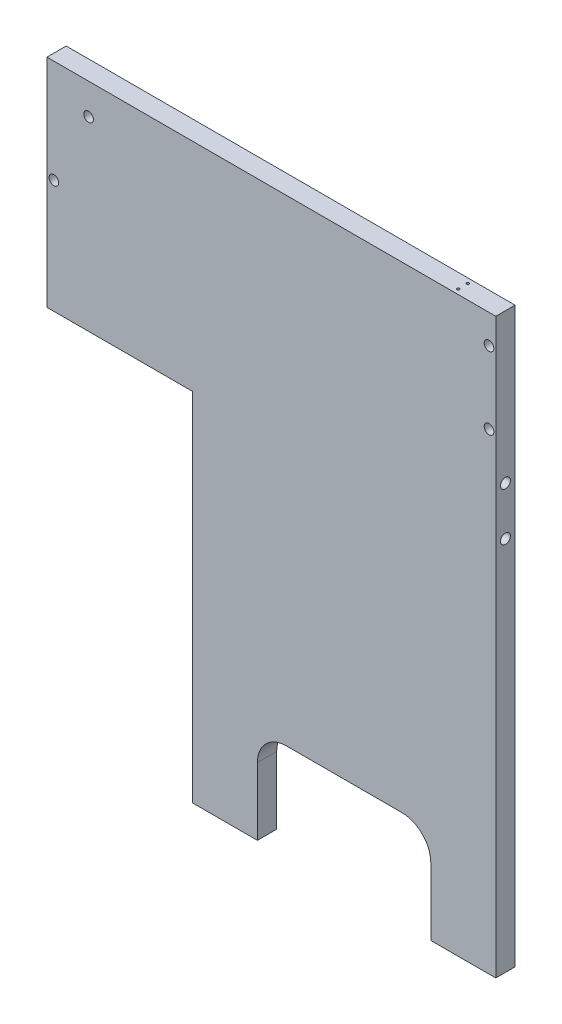
ISO-10303-21;
HEADER;
FILE_DESCRIPTION(('STEP AP214'),'2;1');
FILE_NAME('part.step','',(''),(''),'','','');
FILE_SCHEMA(('AUTOMOTIVE_DESIGN { 1 0 10303 214 1 1 1 1 }'));
ENDSEC;
DATA;
#1=APPLICATION_CONTEXT('core data for automotive mechanical design processes');
#2=APPLICATION_PROTOCOL_DEFINITION('international standard','automotive_design',2000,#1);
#3=PRODUCT_CONTEXT('',#1,'mechanical');
#4=PRODUCT('Part','Part','',(#3));
#5=PRODUCT_RELATED_PRODUCT_CATEGORY('part','',(#4));
#6=PRODUCT_DEFINITION_FORMATION('','',#4);
#7=PRODUCT_DEFINITION_CONTEXT('part definition',#1,'design');
#8=PRODUCT_DEFINITION('design','',#6,#7);
#9=PRODUCT_DEFINITION_SHAPE('','',#8);
#10=(LENGTH_UNIT() NAMED_UNIT(*) SI_UNIT(.MILLI.,.METRE.));
#11=(NAMED_UNIT(*) PLANE_ANGLE_UNIT() SI_UNIT($,.RADIAN.));
#12=(NAMED_UNIT(*) SI_UNIT($,.STERADIAN.) SOLID_ANGLE_UNIT());
#13=UNCERTAINTY_MEASURE_WITH_UNIT(LENGTH_MEASURE(1.E-05),#10,'distance_accuracy_value','');
#14=(GEOMETRIC_REPRESENTATION_CONTEXT(3) GLOBAL_UNCERTAINTY_ASSIGNED_CONTEXT((#13)) GLOBAL_UNIT_ASSIGNED_CONTEXT((#10,
#11,#12)) REPRESENTATION_CONTEXT('',''));
#15=CARTESIAN_POINT('',(0.,0.,0.));
#16=DIRECTION('',(0.,0.,1.));
#17=DIRECTION('',(1.,0.,0.));
#18=AXIS2_PLACEMENT_3D('',#15,#16,#17);
#19=CARTESIAN_POINT('',(466.,-595.,-20.));
#20=DIRECTION('',(0.,-1.,0.));
#21=DIRECTION('',(0.,0.,-1.));
#22=AXIS2_PLACEMENT_3D('',#19,#20,#21);
#23=PLANE('',#22);
#24=DIRECTION('',(0.,0.,1.));
#25=VECTOR('',#24,1.);
#26=CARTESIAN_POINT('',(218.5,-595.,-20.));
#27=LINE('',#26,#25);
#28=CARTESIAN_POINT('',(218.5,-595.,-20.));
#29=VERTEX_POINT('',#28);
#30=CARTESIAN_POINT('',(218.5,-595.,0.));
#31=VERTEX_POINT('',#30);
#32=EDGE_CURVE('E139',#29,#31,#27,.T.);
#33=ORIENTED_EDGE('',*,*,#32,.T.);
#34=DIRECTION('',(1.,0.,0.));
#35=VECTOR('',#34,1.);
#36=CARTESIAN_POINT('',(466.,-595.,0.));
#37=LINE('',#36,#35);
#38=CARTESIAN_POINT('',(151.,-595.,0.));
#39=VERTEX_POINT('',#38);
#40=EDGE_CURVE('E146',#39,#31,#37,.T.);
#41=ORIENTED_EDGE('',*,*,#40,.F.);
#42=DIRECTION('',(0.,0.,1.));
#43=VECTOR('',#42,1.);
#44=CARTESIAN_POINT('',(151.,-595.,-20.));
#45=LINE('',#44,#43);
#46=CARTESIAN_POINT('',(151.,-595.,-20.));
#47=VERTEX_POINT('',#46);
#48=EDGE_CURVE('E125',#47,#39,#45,.T.);
#49=ORIENTED_EDGE('',*,*,#48,.F.);
#50=DIRECTION('',(1.,0.,0.));
#51=VECTOR('',#50,1.);
#52=CARTESIAN_POINT('',(466.,-595.,-20.));
#53=LINE('',#52,#51);
#54=EDGE_CURVE('E115',#47,#29,#53,.T.);
#55=ORIENTED_EDGE('',*,*,#54,.T.);
#56=EDGE_LOOP('',(#33,#41,#49,#55));
#57=FACE_BOUND('',#56,.T.);
#58=ADVANCED_FACE('F35',(#57),#23,.T.);
#59=CARTESIAN_POINT('',(0.,-225.,-20.));
#60=DIRECTION('',(-1.,0.,0.));
#61=DIRECTION('',(0.,0.,1.));
#62=AXIS2_PLACEMENT_3D('',#59,#60,#61);
#63=PLANE('',#62);
#64=CARTESIAN_POINT('',(0.,-205.,-10.));
#65=DIRECTION('',(-1.,0.,0.));
#66=DIRECTION('',(0.,0.,1.));
#67=AXIS2_PLACEMENT_3D('',#64,#65,#66);
#68=CIRCLE('',#67,5.14999999999999);
#69=CARTESIAN_POINT('',(0.,-205.,-4.85000000000001));
#70=VERTEX_POINT('',#69);
#71=EDGE_CURVE('E331',#70,#70,#68,.T.);
#72=ORIENTED_EDGE('',*,*,#71,.F.);
#73=EDGE_LOOP('',(#72));
#74=FACE_BOUND('',#73,.T.);
#75=CARTESIAN_POINT('',(0.,-155.,-10.));
#76=DIRECTION('',(-1.,0.,0.));
#77=DIRECTION('',(0.,0.,1.));
#78=AXIS2_PLACEMENT_3D('',#75,#76,#77);
#79=CIRCLE('',#78,5.14999999999999);
#80=CARTESIAN_POINT('',(0.,-155.,-4.85000000000001));
#81=VERTEX_POINT('',#80);
#82=EDGE_CURVE('E323',#81,#81,#79,.T.);
#83=ORIENTED_EDGE('',*,*,#82,.F.);
#84=EDGE_LOOP('',(#83));
#85=FACE_BOUND('',#84,.T.);
#86=DIRECTION('',(0.,-1.,0.));
#87=VECTOR('',#86,1.);
#88=CARTESIAN_POINT('',(0.,-225.,0.));
#89=LINE('',#88,#87);
#90=CARTESIAN_POINT('',(0.,0.,0.));
#91=VERTEX_POINT('',#90);
#92=CARTESIAN_POINT('',(0.,-225.,0.));
#93=VERTEX_POINT('',#92);
#94=EDGE_CURVE('E135',#91,#93,#89,.T.);
#95=ORIENTED_EDGE('',*,*,#94,.F.);
#96=DIRECTION('',(0.,0.,1.));
#97=VECTOR('',#96,1.);
#98=CARTESIAN_POINT('',(0.,0.,-20.));
#99=LINE('',#98,#97);
#100=CARTESIAN_POINT('',(0.,0.,-20.));
#101=VERTEX_POINT('',#100);
#102=EDGE_CURVE('E11',#101,#91,#99,.T.);
#103=ORIENTED_EDGE('',*,*,#102,.F.);
#104=DIRECTION('',(0.,-1.,0.));
#105=VECTOR('',#104,1.);
#106=CARTESIAN_POINT('',(0.,-225.,-20.));
#107=LINE('',#106,#105);
#108=CARTESIAN_POINT('',(0.,-225.,-20.));
#109=VERTEX_POINT('',#108);
#110=EDGE_CURVE('E152',#101,#109,#107,.T.);
#111=ORIENTED_EDGE('',*,*,#110,.T.);
#112=DIRECTION('',(0.,0.,1.));
#113=VECTOR('',#112,1.);
#114=CARTESIAN_POINT('',(0.,-225.,-20.));
#115=LINE('',#114,#113);
#116=EDGE_CURVE('E39',#109,#93,#115,.T.);
#117=ORIENTED_EDGE('',*,*,#116,.T.);
#118=EDGE_LOOP('',(#95,#103,#111,#117));
#119=FACE_BOUND('',#118,.T.);
#120=ADVANCED_FACE('F37',(#74,#85,#119),#63,.T.);
#121=CARTESIAN_POINT('',(0.,0.,-20.));
#122=DIRECTION('',(0.,1.,0.));
#123=DIRECTION('',(0.,0.,1.));
#124=AXIS2_PLACEMENT_3D('',#121,#122,#123);
#125=PLANE('',#124);
#126=CARTESIAN_POINT('',(422.,0.,-5.));
#127=DIRECTION('',(0.,1.,0.));
#128=DIRECTION('',(0.,0.,1.));
#129=AXIS2_PLACEMENT_3D('',#126,#127,#128);
#130=CIRCLE('',#129,1.24999999999996);
#131=CARTESIAN_POINT('',(422.,0.,-3.75000000000004));
#132=VERTEX_POINT('',#131);
#133=EDGE_CURVE('E535',#132,#132,#130,.T.);
#134=ORIENTED_EDGE('',*,*,#133,.F.);
#135=EDGE_LOOP('',(#134));
#136=FACE_BOUND('',#135,.T.);
#137=CARTESIAN_POINT('',(422.,0.,-15.));
#138=DIRECTION('',(0.,1.,0.));
#139=DIRECTION('',(0.,0.,1.));
#140=AXIS2_PLACEMENT_3D('',#137,#138,#139);
#141=CIRCLE('',#140,1.24999999999996);
#142=CARTESIAN_POINT('',(422.,0.,-13.75));
#143=VERTEX_POINT('',#142);
#144=EDGE_CURVE('E534',#143,#143,#141,.T.);
#145=ORIENTED_EDGE('',*,*,#144,.F.);
#146=EDGE_LOOP('',(#145));
#147=FACE_BOUND('',#146,.T.);
#148=DIRECTION('',(-1.,0.,0.));
#149=VECTOR('',#148,1.);
#150=CARTESIAN_POINT('',(0.,0.,0.));
#151=LINE('',#150,#149);
#152=CARTESIAN_POINT('',(466.,0.,0.));
#153=VERTEX_POINT('',#152);
#154=EDGE_CURVE('E150',#153,#91,#151,.T.);
#155=ORIENTED_EDGE('',*,*,#154,.F.);
#156=DIRECTION('',(0.,0.,1.));
#157=VECTOR('',#156,1.);
#158=CARTESIAN_POINT('',(466.,0.,-20.));
#159=LINE('',#158,#157);
#160=CARTESIAN_POINT('',(466.,0.,-20.));
#161=VERTEX_POINT('',#160);
#162=EDGE_CURVE('E44',#161,#153,#159,.T.);
#163=ORIENTED_EDGE('',*,*,#162,.F.);
#164=DIRECTION('',(-1.,0.,0.));
#165=VECTOR('',#164,1.);
#166=CARTESIAN_POINT('',(0.,0.,-20.));
#167=LINE('',#166,#165);
#168=EDGE_CURVE('E129',#161,#101,#167,.T.);
#169=ORIENTED_EDGE('',*,*,#168,.T.);
#170=ORIENTED_EDGE('',*,*,#102,.T.);
#171=EDGE_LOOP('',(#155,#163,#169,#170));
#172=FACE_BOUND('',#171,.T.);
#173=ADVANCED_FACE('F160',(#136,#147,#172),#125,.T.);
#174=CARTESIAN_POINT('',(466.,0.,-20.));
#175=DIRECTION('',(1.,0.,0.));
#176=DIRECTION('',(0.,0.,-1.));
#177=AXIS2_PLACEMENT_3D('',#174,#175,#176);
#178=PLANE('',#177);
#179=CARTESIAN_POINT('',(466.,-205.,-10.));
#180=DIRECTION('',(1.,0.,0.));
#181=DIRECTION('',(0.,0.,-1.));
#182=AXIS2_PLACEMENT_3D('',#179,#180,#181);
#183=CIRCLE('',#182,5.15);
#184=CARTESIAN_POINT('',(466.,-205.,-15.15));
#185=VERTEX_POINT('',#184);
#186=EDGE_CURVE('E544',#185,#185,#183,.T.);
#187=ORIENTED_EDGE('',*,*,#186,.F.);
#188=EDGE_LOOP('',(#187));
#189=FACE_BOUND('',#188,.T.);
#190=CARTESIAN_POINT('',(466.,-155.,-10.));
#191=DIRECTION('',(1.,0.,0.));
#192=DIRECTION('',(0.,0.,-1.));
#193=AXIS2_PLACEMENT_3D('',#190,#191,#192);
#194=CIRCLE('',#193,5.15);
#195=CARTESIAN_POINT('',(466.,-155.,-15.15));
#196=VERTEX_POINT('',#195);
#197=EDGE_CURVE('E549',#196,#196,#194,.T.);
#198=ORIENTED_EDGE('',*,*,#197,.F.);
#199=EDGE_LOOP('',(#198));
#200=FACE_BOUND('',#199,.T.);
#201=DIRECTION('',(0.,1.,0.));
#202=VECTOR('',#201,1.);
#203=CARTESIAN_POINT('',(466.,0.,0.));
#204=LINE('',#203,#202);
#205=CARTESIAN_POINT('',(466.,-595.,0.));
#206=VERTEX_POINT('',#205);
#207=EDGE_CURVE('E124',#206,#153,#204,.T.);
#208=ORIENTED_EDGE('',*,*,#207,.F.);
#209=DIRECTION('',(0.,0.,1.));
#210=VECTOR('',#209,1.);
#211=CARTESIAN_POINT('',(466.,-595.,-20.));
#212=LINE('',#211,#210);
#213=CARTESIAN_POINT('',(466.,-595.,-20.));
#214=VERTEX_POINT('',#213);
#215=EDGE_CURVE('E109',#214,#206,#212,.T.);
#216=ORIENTED_EDGE('',*,*,#215,.F.);
#217=DIRECTION('',(0.,1.,0.));
#218=VECTOR('',#217,1.);
#219=CARTESIAN_POINT('',(466.,0.,-20.));
#220=LINE('',#219,#218);
#221=EDGE_CURVE('E121',#214,#161,#220,.T.);
#222=ORIENTED_EDGE('',*,*,#221,.T.);
#223=ORIENTED_EDGE('',*,*,#162,.T.);
#224=EDGE_LOOP('',(#208,#216,#222,#223));
#225=FACE_BOUND('',#224,.T.);
#226=ADVANCED_FACE('F120',(#189,#200,#225),#178,.T.);
#227=DIRECTION('',(0.,0.,1.));
#228=VECTOR('',#227,1.);
#229=CARTESIAN_POINT('',(398.5,-595.,-20.));
#230=LINE('',#229,#228);
#231=CARTESIAN_POINT('',(398.5,-595.,-20.));
#232=VERTEX_POINT('',#231);
#233=CARTESIAN_POINT('',(398.5,-595.,0.));
#234=VERTEX_POINT('',#233);
#235=EDGE_CURVE('E52',#232,#234,#230,.T.);
#236=ORIENTED_EDGE('',*,*,#235,.F.);
#237=EDGE_CURVE('E105',#232,#214,#53,.T.);
#238=ORIENTED_EDGE('',*,*,#237,.T.);
#239=ORIENTED_EDGE('',*,*,#215,.T.);
#240=EDGE_CURVE('E145',#234,#206,#37,.T.);
#241=ORIENTED_EDGE('',*,*,#240,.F.);
#242=EDGE_LOOP('',(#236,#238,#239,#241));
#243=FACE_BOUND('',#242,.T.);
#244=ADVANCED_FACE('F107',(#243),#23,.T.);
#245=CARTESIAN_POINT('',(151.,-595.,-20.));
#246=DIRECTION('',(-1.,0.,0.));
#247=DIRECTION('',(0.,0.,1.));
#248=AXIS2_PLACEMENT_3D('',#245,#246,#247);
#249=PLANE('',#248);
#250=DIRECTION('',(0.,-1.,0.));
#251=VECTOR('',#250,1.);
#252=CARTESIAN_POINT('',(151.,-595.,0.));
#253=LINE('',#252,#251);
#254=CARTESIAN_POINT('',(151.,-225.,0.));
#255=VERTEX_POINT('',#254);
#256=EDGE_CURVE('E142',#255,#39,#253,.T.);
#257=ORIENTED_EDGE('',*,*,#256,.F.);
#258=DIRECTION('',(0.,0.,1.));
#259=VECTOR('',#258,1.);
#260=CARTESIAN_POINT('',(151.,-225.,-20.));
#261=LINE('',#260,#259);
#262=CARTESIAN_POINT('',(151.,-225.,-20.));
#263=VERTEX_POINT('',#262);
#264=EDGE_CURVE('E155',#263,#255,#261,.T.);
#265=ORIENTED_EDGE('',*,*,#264,.F.);
#266=DIRECTION('',(0.,-1.,0.));
#267=VECTOR('',#266,1.);
#268=CARTESIAN_POINT('',(151.,-595.,-20.));
#269=LINE('',#268,#267);
#270=EDGE_CURVE('E116',#263,#47,#269,.T.);
#271=ORIENTED_EDGE('',*,*,#270,.T.);
#272=ORIENTED_EDGE('',*,*,#48,.T.);
#273=EDGE_LOOP('',(#257,#265,#271,#272));
#274=FACE_BOUND('',#273,.T.);
#275=ADVANCED_FACE('F184',(#274),#249,.T.);
#276=CARTESIAN_POINT('',(151.,-225.,-20.));
#277=DIRECTION('',(0.,-1.,0.));
#278=DIRECTION('',(1.,0.,0.));
#279=AXIS2_PLACEMENT_3D('',#276,#277,#278);
#280=PLANE('',#279);
#281=DIRECTION('',(1.,0.,0.));
#282=VECTOR('',#281,1.);
#283=CARTESIAN_POINT('',(151.,-225.,0.));
#284=LINE('',#283,#282);
#285=EDGE_CURVE('E138',#93,#255,#284,.T.);
#286=ORIENTED_EDGE('',*,*,#285,.F.);
#287=ORIENTED_EDGE('',*,*,#116,.F.);
#288=DIRECTION('',(1.,0.,0.));
#289=VECTOR('',#288,1.);
#290=CARTESIAN_POINT('',(151.,-225.,-20.));
#291=LINE('',#290,#289);
#292=EDGE_CURVE('E223',#109,#263,#291,.T.);
#293=ORIENTED_EDGE('',*,*,#292,.T.);
#294=ORIENTED_EDGE('',*,*,#264,.T.);
#295=EDGE_LOOP('',(#286,#287,#293,#294));
#296=FACE_BOUND('',#295,.T.);
#297=ADVANCED_FACE('F157',(#296),#280,.T.);
#298=CARTESIAN_POINT('',(0.,0.,-20.));
#299=DIRECTION('',(0.,0.,-1.));
#300=DIRECTION('',(-1.,0.,0.));
#301=AXIS2_PLACEMENT_3D('',#298,#299,#300);
#302=PLANE('',#301);
#303=CARTESIAN_POINT('',(43.2,-32.,-20.));
#304=DIRECTION('',(0.,0.,1.));
#305=DIRECTION('',(1.,0.,0.));
#306=AXIS2_PLACEMENT_3D('',#303,#304,#305);
#307=CIRCLE('',#306,5.);
#308=CARTESIAN_POINT('',(48.2,-32.,-20.));
#309=VERTEX_POINT('',#308);
#310=EDGE_CURVE('E238',#309,#309,#307,.T.);
#311=ORIENTED_EDGE('',*,*,#310,.T.);
#312=EDGE_LOOP('',(#311));
#313=FACE_BOUND('',#312,.T.);
#314=CARTESIAN_POINT('',(459.,-30.,-20.));
#315=DIRECTION('',(0.,0.,1.));
#316=DIRECTION('',(1.,0.,0.));
#317=AXIS2_PLACEMENT_3D('',#314,#315,#316);
#318=CIRCLE('',#317,4.99999999999999);
#319=CARTESIAN_POINT('',(464.,-30.,-20.));
#320=VERTEX_POINT('',#319);
#321=EDGE_CURVE('E337',#320,#320,#318,.T.);
#322=ORIENTED_EDGE('',*,*,#321,.T.);
#323=EDGE_LOOP('',(#322));
#324=FACE_BOUND('',#323,.T.);
#325=CARTESIAN_POINT('',(459.,-105.,-20.));
#326=DIRECTION('',(0.,0.,1.));
#327=DIRECTION('',(1.,0.,0.));
#328=AXIS2_PLACEMENT_3D('',#325,#326,#327);
#329=CIRCLE('',#328,4.99999999999999);
#330=CARTESIAN_POINT('',(464.,-105.,-20.));
#331=VERTEX_POINT('',#330);
#332=EDGE_CURVE('E341',#331,#331,#329,.T.);
#333=ORIENTED_EDGE('',*,*,#332,.T.);
#334=EDGE_LOOP('',(#333));
#335=FACE_BOUND('',#334,.T.);
#336=CARTESIAN_POINT('',(7.20000000000002,-107.,-20.));
#337=DIRECTION('',(0.,0.,1.));
#338=DIRECTION('',(1.,0.,0.));
#339=AXIS2_PLACEMENT_3D('',#336,#337,#338);
#340=CIRCLE('',#339,5.00000000000001);
#341=CARTESIAN_POINT('',(12.2,-107.,-20.));
#342=VERTEX_POINT('',#341);
#343=EDGE_CURVE('E319',#342,#342,#340,.T.);
#344=ORIENTED_EDGE('',*,*,#343,.T.);
#345=EDGE_LOOP('',(#344));
#346=FACE_BOUND('',#345,.T.);
#347=DIRECTION('',(0.,-1.,0.));
#348=VECTOR('',#347,1.);
#349=CARTESIAN_POINT('',(218.5,-595.,-20.));
#350=LINE('',#349,#348);
#351=CARTESIAN_POINT('',(218.5,-525.,-20.));
#352=VERTEX_POINT('',#351);
#353=EDGE_CURVE('E221',#352,#29,#350,.T.);
#354=ORIENTED_EDGE('',*,*,#353,.T.);
#355=ORIENTED_EDGE('',*,*,#54,.F.);
#356=ORIENTED_EDGE('',*,*,#270,.F.);
#357=ORIENTED_EDGE('',*,*,#292,.F.);
#358=ORIENTED_EDGE('',*,*,#110,.F.);
#359=ORIENTED_EDGE('',*,*,#168,.F.);
#360=ORIENTED_EDGE('',*,*,#221,.F.);
#361=ORIENTED_EDGE('',*,*,#237,.F.);
#362=DIRECTION('',(0.,1.,0.));
#363=VECTOR('',#362,1.);
#364=CARTESIAN_POINT('',(398.5,-525.,-20.));
#365=LINE('',#364,#363);
#366=CARTESIAN_POINT('',(398.5,-525.,-20.));
#367=VERTEX_POINT('',#366);
#368=EDGE_CURVE('E247',#232,#367,#365,.T.);
#369=ORIENTED_EDGE('',*,*,#368,.T.);
#370=CARTESIAN_POINT('',(368.5,-525.,-20.));
#371=DIRECTION('',(0.,0.,1.));
#372=DIRECTION('',(-1.,0.,0.));
#373=AXIS2_PLACEMENT_3D('',#370,#371,#372);
#374=CIRCLE('',#373,30.);
#375=CARTESIAN_POINT('',(368.5,-495.,-20.));
#376=VERTEX_POINT('',#375);
#377=EDGE_CURVE('E248',#367,#376,#374,.T.);
#378=ORIENTED_EDGE('',*,*,#377,.T.);
#379=DIRECTION('',(-1.,0.,0.));
#380=VECTOR('',#379,1.);
#381=CARTESIAN_POINT('',(248.5,-495.,-20.));
#382=LINE('',#381,#380);
#383=CARTESIAN_POINT('',(248.5,-495.,-20.));
#384=VERTEX_POINT('',#383);
#385=EDGE_CURVE('E231',#376,#384,#382,.T.);
#386=ORIENTED_EDGE('',*,*,#385,.T.);
#387=CARTESIAN_POINT('',(248.5,-525.,-20.));
#388=DIRECTION('',(0.,0.,1.));
#389=DIRECTION('',(-1.,0.,0.));
#390=AXIS2_PLACEMENT_3D('',#387,#388,#389);
#391=CIRCLE('',#390,30.);
#392=EDGE_CURVE('E228',#384,#352,#391,.T.);
#393=ORIENTED_EDGE('',*,*,#392,.T.);
#394=EDGE_LOOP('',(#354,#355,#356,#357,#358,#359,#360,#361,#369,#378,#386,#393));
#395=FACE_BOUND('',#394,.T.);
#396=ADVANCED_FACE('F128',(#313,#324,#335,#346,#395),#302,.T.);
#397=CARTESIAN_POINT('',(0.,0.,0.));
#398=DIRECTION('',(0.,0.,-1.));
#399=DIRECTION('',(-1.,0.,0.));
#400=AXIS2_PLACEMENT_3D('',#397,#398,#399);
#401=PLANE('',#400);
#402=CARTESIAN_POINT('',(43.2,-32.,0.));
#403=DIRECTION('',(0.,0.,1.));
#404=DIRECTION('',(1.,0.,0.));
#405=AXIS2_PLACEMENT_3D('',#402,#403,#404);
#406=CIRCLE('',#405,5.);
#407=CARTESIAN_POINT('',(48.2,-32.,0.));
#408=VERTEX_POINT('',#407);
#409=EDGE_CURVE('E307',#408,#408,#406,.T.);
#410=ORIENTED_EDGE('',*,*,#409,.F.);
#411=EDGE_LOOP('',(#410));
#412=FACE_BOUND('',#411,.T.);
#413=CARTESIAN_POINT('',(459.,-30.,0.));
#414=DIRECTION('',(0.,0.,1.));
#415=DIRECTION('',(1.,0.,0.));
#416=AXIS2_PLACEMENT_3D('',#413,#414,#415);
#417=CIRCLE('',#416,4.99999999999999);
#418=CARTESIAN_POINT('',(464.,-30.,0.));
#419=VERTEX_POINT('',#418);
#420=EDGE_CURVE('E311',#419,#419,#417,.T.);
#421=ORIENTED_EDGE('',*,*,#420,.F.);
#422=EDGE_LOOP('',(#421));
#423=FACE_BOUND('',#422,.T.);
#424=CARTESIAN_POINT('',(459.,-105.,0.));
#425=DIRECTION('',(0.,0.,1.));
#426=DIRECTION('',(1.,0.,0.));
#427=AXIS2_PLACEMENT_3D('',#424,#425,#426);
#428=CIRCLE('',#427,4.99999999999999);
#429=CARTESIAN_POINT('',(464.,-105.,0.));
#430=VERTEX_POINT('',#429);
#431=EDGE_CURVE('E315',#430,#430,#428,.T.);
#432=ORIENTED_EDGE('',*,*,#431,.F.);
#433=EDGE_LOOP('',(#432));
#434=FACE_BOUND('',#433,.T.);
#435=CARTESIAN_POINT('',(7.20000000000002,-107.,0.));
#436=DIRECTION('',(0.,0.,1.));
#437=DIRECTION('',(1.,0.,0.));
#438=AXIS2_PLACEMENT_3D('',#435,#436,#437);
#439=CIRCLE('',#438,5.00000000000001);
#440=CARTESIAN_POINT('',(12.2,-107.,0.));
#441=VERTEX_POINT('',#440);
#442=EDGE_CURVE('E254',#441,#441,#439,.T.);
#443=ORIENTED_EDGE('',*,*,#442,.F.);
#444=EDGE_LOOP('',(#443));
#445=FACE_BOUND('',#444,.T.);
#446=ORIENTED_EDGE('',*,*,#40,.T.);
#447=DIRECTION('',(0.,-1.,0.));
#448=VECTOR('',#447,1.);
#449=CARTESIAN_POINT('',(218.5,-595.,0.));
#450=LINE('',#449,#448);
#451=CARTESIAN_POINT('',(218.5,-525.,0.));
#452=VERTEX_POINT('',#451);
#453=EDGE_CURVE('E199',#452,#31,#450,.T.);
#454=ORIENTED_EDGE('',*,*,#453,.F.);
#455=CARTESIAN_POINT('',(248.5,-525.,0.));
#456=DIRECTION('',(0.,0.,1.));
#457=DIRECTION('',(-1.,0.,0.));
#458=AXIS2_PLACEMENT_3D('',#455,#456,#457);
#459=CIRCLE('',#458,30.);
#460=CARTESIAN_POINT('',(248.5,-495.,0.));
#461=VERTEX_POINT('',#460);
#462=EDGE_CURVE('E243',#461,#452,#459,.T.);
#463=ORIENTED_EDGE('',*,*,#462,.F.);
#464=DIRECTION('',(-1.,0.,0.));
#465=VECTOR('',#464,1.);
#466=CARTESIAN_POINT('',(248.5,-495.,0.));
#467=LINE('',#466,#465);
#468=CARTESIAN_POINT('',(368.5,-495.,0.));
#469=VERTEX_POINT('',#468);
#470=EDGE_CURVE('E241',#469,#461,#467,.T.);
#471=ORIENTED_EDGE('',*,*,#470,.F.);
#472=CARTESIAN_POINT('',(368.5,-525.,0.));
#473=DIRECTION('',(0.,0.,1.));
#474=DIRECTION('',(-1.,0.,0.));
#475=AXIS2_PLACEMENT_3D('',#472,#473,#474);
#476=CIRCLE('',#475,30.);
#477=CARTESIAN_POINT('',(398.5,-525.,0.));
#478=VERTEX_POINT('',#477);
#479=EDGE_CURVE('E237',#478,#469,#476,.T.);
#480=ORIENTED_EDGE('',*,*,#479,.F.);
#481=DIRECTION('',(0.,1.,0.));
#482=VECTOR('',#481,1.);
#483=CARTESIAN_POINT('',(398.5,-525.,0.));
#484=LINE('',#483,#482);
#485=EDGE_CURVE('E235',#234,#478,#484,.T.);
#486=ORIENTED_EDGE('',*,*,#485,.F.);
#487=ORIENTED_EDGE('',*,*,#240,.T.);
#488=ORIENTED_EDGE('',*,*,#207,.T.);
#489=ORIENTED_EDGE('',*,*,#154,.T.);
#490=ORIENTED_EDGE('',*,*,#94,.T.);
#491=ORIENTED_EDGE('',*,*,#285,.T.);
#492=ORIENTED_EDGE('',*,*,#256,.T.);
#493=EDGE_LOOP('',(#446,#454,#463,#471,#480,#486,#487,#488,#489,#490,#491,#492));
#494=FACE_BOUND('',#493,.T.);
#495=ADVANCED_FACE('F159',(#412,#423,#434,#445,#494),#401,.F.);
#496=CARTESIAN_POINT('',(218.5,-595.,-20.));
#497=DIRECTION('',(-1.,0.,0.));
#498=DIRECTION('',(0.,0.,1.));
#499=AXIS2_PLACEMENT_3D('',#496,#497,#498);
#500=PLANE('',#499);
#501=ORIENTED_EDGE('',*,*,#453,.T.);
#502=ORIENTED_EDGE('',*,*,#32,.F.);
#503=ORIENTED_EDGE('',*,*,#353,.F.);
#504=DIRECTION('',(0.,0.,1.));
#505=VECTOR('',#504,1.);
#506=CARTESIAN_POINT('',(218.5,-525.,-20.));
#507=LINE('',#506,#505);
#508=EDGE_CURVE('E204',#352,#452,#507,.T.);
#509=ORIENTED_EDGE('',*,*,#508,.T.);
#510=EDGE_LOOP('',(#501,#502,#503,#509));
#511=FACE_BOUND('',#510,.T.);
#512=ADVANCED_FACE('F277',(#511),#500,.F.);
#513=CARTESIAN_POINT('',(248.5,-525.,-20.));
#514=DIRECTION('',(0.,0.,1.));
#515=DIRECTION('',(1.,0.,0.));
#516=AXIS2_PLACEMENT_3D('',#513,#514,#515);
#517=CYLINDRICAL_SURFACE('',#516,30.);
#518=ORIENTED_EDGE('',*,*,#462,.T.);
#519=ORIENTED_EDGE('',*,*,#508,.F.);
#520=ORIENTED_EDGE('',*,*,#392,.F.);
#521=DIRECTION('',(0.,0.,1.));
#522=VECTOR('',#521,1.);
#523=CARTESIAN_POINT('',(248.5,-495.,-20.));
#524=LINE('',#523,#522);
#525=EDGE_CURVE('E207',#384,#461,#524,.T.);
#526=ORIENTED_EDGE('',*,*,#525,.T.);
#527=EDGE_LOOP('',(#518,#519,#520,#526));
#528=FACE_BOUND('',#527,.T.);
#529=ADVANCED_FACE('F278',(#528),#517,.F.);
#530=CARTESIAN_POINT('',(248.5,-495.,-20.));
#531=DIRECTION('',(0.,1.,0.));
#532=DIRECTION('',(-1.,0.,0.));
#533=AXIS2_PLACEMENT_3D('',#530,#531,#532);
#534=PLANE('',#533);
#535=ORIENTED_EDGE('',*,*,#470,.T.);
#536=ORIENTED_EDGE('',*,*,#525,.F.);
#537=ORIENTED_EDGE('',*,*,#385,.F.);
#538=DIRECTION('',(0.,0.,1.));
#539=VECTOR('',#538,1.);
#540=CARTESIAN_POINT('',(368.5,-495.,-20.));
#541=LINE('',#540,#539);
#542=EDGE_CURVE('E214',#376,#469,#541,.T.);
#543=ORIENTED_EDGE('',*,*,#542,.T.);
#544=EDGE_LOOP('',(#535,#536,#537,#543));
#545=FACE_BOUND('',#544,.T.);
#546=ADVANCED_FACE('F263',(#545),#534,.F.);
#547=CARTESIAN_POINT('',(368.5,-525.,-20.));
#548=DIRECTION('',(0.,0.,1.));
#549=DIRECTION('',(1.,0.,0.));
#550=AXIS2_PLACEMENT_3D('',#547,#548,#549);
#551=CYLINDRICAL_SURFACE('',#550,30.);
#552=ORIENTED_EDGE('',*,*,#479,.T.);
#553=ORIENTED_EDGE('',*,*,#542,.F.);
#554=ORIENTED_EDGE('',*,*,#377,.F.);
#555=DIRECTION('',(0.,0.,1.));
#556=VECTOR('',#555,1.);
#557=CARTESIAN_POINT('',(398.5,-525.,-20.));
#558=LINE('',#557,#556);
#559=EDGE_CURVE('E217',#367,#478,#558,.T.);
#560=ORIENTED_EDGE('',*,*,#559,.T.);
#561=EDGE_LOOP('',(#552,#553,#554,#560));
#562=FACE_BOUND('',#561,.T.);
#563=ADVANCED_FACE('F281',(#562),#551,.F.);
#564=CARTESIAN_POINT('',(398.5,-525.,-20.));
#565=DIRECTION('',(1.,0.,0.));
#566=DIRECTION('',(0.,0.,-1.));
#567=AXIS2_PLACEMENT_3D('',#564,#565,#566);
#568=PLANE('',#567);
#569=ORIENTED_EDGE('',*,*,#485,.T.);
#570=ORIENTED_EDGE('',*,*,#559,.F.);
#571=ORIENTED_EDGE('',*,*,#368,.F.);
#572=ORIENTED_EDGE('',*,*,#235,.T.);
#573=EDGE_LOOP('',(#569,#570,#571,#572));
#574=FACE_BOUND('',#573,.T.);
#575=ADVANCED_FACE('F282',(#574),#568,.F.);
#576=CARTESIAN_POINT('',(7.20000000000002,-107.,-20.));
#577=DIRECTION('',(0.,0.,1.));
#578=DIRECTION('',(1.,0.,0.));
#579=AXIS2_PLACEMENT_3D('',#576,#577,#578);
#580=CYLINDRICAL_SURFACE('',#579,5.00000000000001);
#581=ORIENTED_EDGE('',*,*,#343,.F.);
#582=EDGE_LOOP('',(#581));
#583=FACE_BOUND('',#582,.T.);
#584=ORIENTED_EDGE('',*,*,#442,.T.);
#585=EDGE_LOOP('',(#584));
#586=FACE_BOUND('',#585,.T.);
#587=ADVANCED_FACE('F284',(#583,#586),#580,.F.);
#588=CARTESIAN_POINT('',(459.,-105.,-20.));
#589=DIRECTION('',(0.,0.,1.));
#590=DIRECTION('',(1.,0.,0.));
#591=AXIS2_PLACEMENT_3D('',#588,#589,#590);
#592=CYLINDRICAL_SURFACE('',#591,4.99999999999999);
#593=ORIENTED_EDGE('',*,*,#332,.F.);
#594=EDGE_LOOP('',(#593));
#595=FACE_BOUND('',#594,.T.);
#596=ORIENTED_EDGE('',*,*,#431,.T.);
#597=EDGE_LOOP('',(#596));
#598=FACE_BOUND('',#597,.T.);
#599=ADVANCED_FACE('F290',(#595,#598),#592,.F.);
#600=CARTESIAN_POINT('',(459.,-30.,-20.));
#601=DIRECTION('',(0.,0.,1.));
#602=DIRECTION('',(1.,0.,0.));
#603=AXIS2_PLACEMENT_3D('',#600,#601,#602);
#604=CYLINDRICAL_SURFACE('',#603,4.99999999999999);
#605=ORIENTED_EDGE('',*,*,#321,.F.);
#606=EDGE_LOOP('',(#605));
#607=FACE_BOUND('',#606,.T.);
#608=ORIENTED_EDGE('',*,*,#420,.T.);
#609=EDGE_LOOP('',(#608));
#610=FACE_BOUND('',#609,.T.);
#611=ADVANCED_FACE('F346',(#607,#610),#604,.F.);
#612=CARTESIAN_POINT('',(43.2,-32.,-20.));
#613=DIRECTION('',(0.,0.,1.));
#614=DIRECTION('',(1.,0.,0.));
#615=AXIS2_PLACEMENT_3D('',#612,#613,#614);
#616=CYLINDRICAL_SURFACE('',#615,5.);
#617=ORIENTED_EDGE('',*,*,#310,.F.);
#618=EDGE_LOOP('',(#617));
#619=FACE_BOUND('',#618,.T.);
#620=ORIENTED_EDGE('',*,*,#409,.T.);
#621=EDGE_LOOP('',(#620));
#622=FACE_BOUND('',#621,.T.);
#623=ADVANCED_FACE('F352',(#619,#622),#616,.F.);
#624=CARTESIAN_POINT('',(20.,-155.,-10.));
#625=DIRECTION('',(-1.,0.,0.));
#626=DIRECTION('',(0.,0.,1.));
#627=AXIS2_PLACEMENT_3D('',#624,#625,#626);
#628=CYLINDRICAL_SURFACE('',#627,5.14999999999999);
#629=CARTESIAN_POINT('',(20.,-155.,-10.));
#630=DIRECTION('',(-1.,0.,0.));
#631=DIRECTION('',(0.,0.,1.));
#632=AXIS2_PLACEMENT_3D('',#629,#630,#631);
#633=CIRCLE('',#632,5.14999999999999);
#634=CARTESIAN_POINT('',(20.,-155.,-4.85000000000001));
#635=VERTEX_POINT('',#634);
#636=EDGE_CURVE('E320',#635,#635,#633,.T.);
#637=ORIENTED_EDGE('',*,*,#636,.F.);
#638=EDGE_LOOP('',(#637));
#639=FACE_BOUND('',#638,.T.);
#640=ORIENTED_EDGE('',*,*,#82,.T.);
#641=EDGE_LOOP('',(#640));
#642=FACE_BOUND('',#641,.T.);
#643=ADVANCED_FACE('F397',(#639,#642),#628,.F.);
#644=CARTESIAN_POINT('',(20.,-155.,-10.));
#645=DIRECTION('',(-1.,0.,0.));
#646=DIRECTION('',(0.,0.,1.));
#647=AXIS2_PLACEMENT_3D('',#644,#645,#646);
#648=PLANE('',#647);
#649=ORIENTED_EDGE('',*,*,#636,.T.);
#650=EDGE_LOOP('',(#649));
#651=FACE_BOUND('',#650,.T.);
#652=ADVANCED_FACE('F413',(#651),#648,.T.);
#653=CARTESIAN_POINT('',(20.,-205.,-10.));
#654=DIRECTION('',(-1.,0.,0.));
#655=DIRECTION('',(0.,0.,1.));
#656=AXIS2_PLACEMENT_3D('',#653,#654,#655);
#657=CYLINDRICAL_SURFACE('',#656,5.14999999999999);
#658=CARTESIAN_POINT('',(20.,-205.,-10.));
#659=DIRECTION('',(-1.,0.,0.));
#660=DIRECTION('',(0.,0.,1.));
#661=AXIS2_PLACEMENT_3D('',#658,#659,#660);
#662=CIRCLE('',#661,5.14999999999999);
#663=CARTESIAN_POINT('',(20.,-205.,-4.85000000000001));
#664=VERTEX_POINT('',#663);
#665=EDGE_CURVE('E328',#664,#664,#662,.T.);
#666=ORIENTED_EDGE('',*,*,#665,.F.);
#667=EDGE_LOOP('',(#666));
#668=FACE_BOUND('',#667,.T.);
#669=ORIENTED_EDGE('',*,*,#71,.T.);
#670=EDGE_LOOP('',(#669));
#671=FACE_BOUND('',#670,.T.);
#672=ADVANCED_FACE('F423',(#668,#671),#657,.F.);
#673=CARTESIAN_POINT('',(20.,-205.,-10.));
#674=DIRECTION('',(-1.,0.,0.));
#675=DIRECTION('',(0.,0.,1.));
#676=AXIS2_PLACEMENT_3D('',#673,#674,#675);
#677=PLANE('',#676);
#678=ORIENTED_EDGE('',*,*,#665,.T.);
#679=EDGE_LOOP('',(#678));
#680=FACE_BOUND('',#679,.T.);
#681=ADVANCED_FACE('F432',(#680),#677,.T.);
#682=CARTESIAN_POINT('',(446.,-155.,-10.));
#683=DIRECTION('',(1.,0.,0.));
#684=DIRECTION('',(0.,0.,-1.));
#685=AXIS2_PLACEMENT_3D('',#682,#683,#684);
#686=CYLINDRICAL_SURFACE('',#685,5.15);
#687=CARTESIAN_POINT('',(446.,-155.,-10.));
#688=DIRECTION('',(1.,0.,0.));
#689=DIRECTION('',(0.,0.,-1.));
#690=AXIS2_PLACEMENT_3D('',#687,#688,#689);
#691=CIRCLE('',#690,5.15);
#692=CARTESIAN_POINT('',(446.,-155.,-15.15));
#693=VERTEX_POINT('',#692);
#694=EDGE_CURVE('E552',#693,#693,#691,.T.);
#695=ORIENTED_EDGE('',*,*,#694,.F.);
#696=EDGE_LOOP('',(#695));
#697=FACE_BOUND('',#696,.T.);
#698=ORIENTED_EDGE('',*,*,#197,.T.);
#699=EDGE_LOOP('',(#698));
#700=FACE_BOUND('',#699,.T.);
#701=ADVANCED_FACE('F442',(#697,#700),#686,.F.);
#702=CARTESIAN_POINT('',(446.,-155.,-10.));
#703=DIRECTION('',(1.,0.,0.));
#704=DIRECTION('',(0.,0.,-1.));
#705=AXIS2_PLACEMENT_3D('',#702,#703,#704);
#706=PLANE('',#705);
#707=ORIENTED_EDGE('',*,*,#694,.T.);
#708=EDGE_LOOP('',(#707));
#709=FACE_BOUND('',#708,.T.);
#710=ADVANCED_FACE('F459',(#709),#706,.T.);
#711=CARTESIAN_POINT('',(446.,-205.,-10.));
#712=DIRECTION('',(1.,0.,0.));
#713=DIRECTION('',(0.,0.,-1.));
#714=AXIS2_PLACEMENT_3D('',#711,#712,#713);
#715=CYLINDRICAL_SURFACE('',#714,5.15);
#716=CARTESIAN_POINT('',(446.,-205.,-10.));
#717=DIRECTION('',(1.,0.,0.));
#718=DIRECTION('',(0.,0.,-1.));
#719=AXIS2_PLACEMENT_3D('',#716,#717,#718);
#720=CIRCLE('',#719,5.15);
#721=CARTESIAN_POINT('',(446.,-205.,-15.15));
#722=VERTEX_POINT('',#721);
#723=EDGE_CURVE('E546',#722,#722,#720,.T.);
#724=ORIENTED_EDGE('',*,*,#723,.F.);
#725=EDGE_LOOP('',(#724));
#726=FACE_BOUND('',#725,.T.);
#727=ORIENTED_EDGE('',*,*,#186,.T.);
#728=EDGE_LOOP('',(#727));
#729=FACE_BOUND('',#728,.T.);
#730=ADVANCED_FACE('F469',(#726,#729),#715,.F.);
#731=CARTESIAN_POINT('',(446.,-205.,-10.));
#732=DIRECTION('',(1.,0.,0.));
#733=DIRECTION('',(0.,0.,-1.));
#734=AXIS2_PLACEMENT_3D('',#731,#732,#733);
#735=PLANE('',#734);
#736=ORIENTED_EDGE('',*,*,#723,.T.);
#737=EDGE_LOOP('',(#736));
#738=FACE_BOUND('',#737,.T.);
#739=ADVANCED_FACE('F478',(#738),#735,.T.);
#740=CARTESIAN_POINT('',(422.,-10.,-15.));
#741=DIRECTION('',(0.,1.,0.));
#742=DIRECTION('',(0.,0.,1.));
#743=AXIS2_PLACEMENT_3D('',#740,#741,#742);
#744=CYLINDRICAL_SURFACE('',#743,1.24999999999996);
#745=CARTESIAN_POINT('',(422.,-10.,-15.));
#746=DIRECTION('',(0.,1.,0.));
#747=DIRECTION('',(0.,0.,1.));
#748=AXIS2_PLACEMENT_3D('',#745,#746,#747);
#749=CIRCLE('',#748,1.24999999999996);
#750=CARTESIAN_POINT('',(422.,-10.,-13.75));
#751=VERTEX_POINT('',#750);
#752=EDGE_CURVE('E538',#751,#751,#749,.T.);
#753=ORIENTED_EDGE('',*,*,#752,.F.);
#754=EDGE_LOOP('',(#753));
#755=FACE_BOUND('',#754,.T.);
#756=ORIENTED_EDGE('',*,*,#144,.T.);
#757=EDGE_LOOP('',(#756));
#758=FACE_BOUND('',#757,.T.);
#759=ADVANCED_FACE('F487',(#755,#758),#744,.F.);
#760=CARTESIAN_POINT('',(422.,-10.,-15.));
#761=DIRECTION('',(0.,1.,0.));
#762=DIRECTION('',(0.,0.,1.));
#763=AXIS2_PLACEMENT_3D('',#760,#761,#762);
#764=PLANE('',#763);
#765=ORIENTED_EDGE('',*,*,#752,.T.);
#766=EDGE_LOOP('',(#765));
#767=FACE_BOUND('',#766,.T.);
#768=ADVANCED_FACE('F497',(#767),#764,.T.);
#769=CARTESIAN_POINT('',(422.,-10.,-5.));
#770=DIRECTION('',(0.,1.,0.));
#771=DIRECTION('',(0.,0.,1.));
#772=AXIS2_PLACEMENT_3D('',#769,#770,#771);
#773=CYLINDRICAL_SURFACE('',#772,1.24999999999996);
#774=CARTESIAN_POINT('',(422.,-10.,-5.));
#775=DIRECTION('',(0.,1.,0.));
#776=DIRECTION('',(0.,0.,1.));
#777=AXIS2_PLACEMENT_3D('',#774,#775,#776);
#778=CIRCLE('',#777,1.24999999999996);
#779=CARTESIAN_POINT('',(422.,-10.,-3.75000000000004));
#780=VERTEX_POINT('',#779);
#781=EDGE_CURVE('E533',#780,#780,#778,.T.);
#782=ORIENTED_EDGE('',*,*,#781,.F.);
#783=EDGE_LOOP('',(#782));
#784=FACE_BOUND('',#783,.T.);
#785=ORIENTED_EDGE('',*,*,#133,.T.);
#786=EDGE_LOOP('',(#785));
#787=FACE_BOUND('',#786,.T.);
#788=ADVANCED_FACE('F504',(#784,#787),#773,.F.);
#789=CARTESIAN_POINT('',(422.,-10.,-5.));
#790=DIRECTION('',(0.,1.,0.));
#791=DIRECTION('',(0.,0.,1.));
#792=AXIS2_PLACEMENT_3D('',#789,#790,#791);
#793=PLANE('',#792);
#794=ORIENTED_EDGE('',*,*,#781,.T.);
#795=EDGE_LOOP('',(#794));
#796=FACE_BOUND('',#795,.T.);
#797=ADVANCED_FACE('F512',(#796),#793,.T.);
#798=CLOSED_SHELL('',(#58,#120,#173,#226,#244,#275,#297,#396,#495,#512,#529,#546,#563,#575,#587,
#599,#611,#623,#643,#652,#672,#681,#701,#710,#730,#739,#759,#768,#788,#797));
#799=MANIFOLD_SOLID_BREP('B2',#798);
#800=ADVANCED_BREP_SHAPE_REPRESENTATION('',(#18,#799),#14);
#801=SHAPE_DEFINITION_REPRESENTATION(#9,#800);
ENDSEC;
END-ISO-10303-21;
